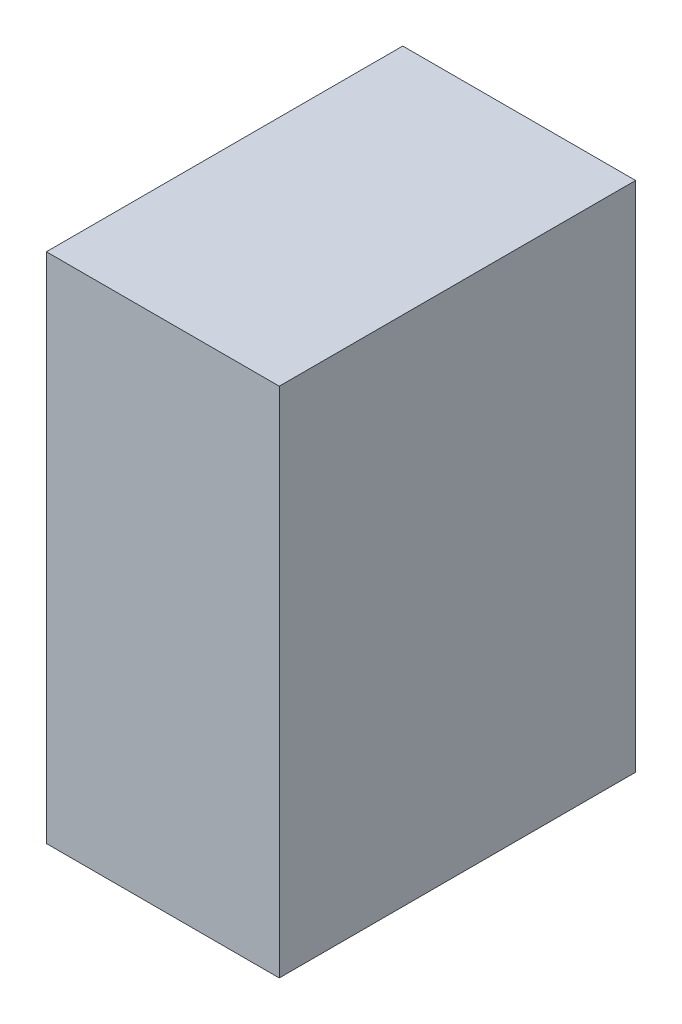
ISO-10303-21;
HEADER;
FILE_DESCRIPTION(('STEP AP214'),'2;1');
FILE_NAME('part.step','',(''),(''),'','','');
FILE_SCHEMA(('AUTOMOTIVE_DESIGN { 1 0 10303 214 1 1 1 1 }'));
ENDSEC;
DATA;
#1=APPLICATION_CONTEXT('core data for automotive mechanical design processes');
#2=APPLICATION_PROTOCOL_DEFINITION('international standard','automotive_design',2000,#1);
#3=PRODUCT_CONTEXT('',#1,'mechanical');
#4=PRODUCT('Part','Part','',(#3));
#5=PRODUCT_RELATED_PRODUCT_CATEGORY('part','',(#4));
#6=PRODUCT_DEFINITION_FORMATION('','',#4);
#7=PRODUCT_DEFINITION_CONTEXT('part definition',#1,'design');
#8=PRODUCT_DEFINITION('design','',#6,#7);
#9=PRODUCT_DEFINITION_SHAPE('','',#8);
#10=(LENGTH_UNIT() NAMED_UNIT(*) SI_UNIT(.MILLI.,.METRE.));
#11=(NAMED_UNIT(*) PLANE_ANGLE_UNIT() SI_UNIT($,.RADIAN.));
#12=(NAMED_UNIT(*) SI_UNIT($,.STERADIAN.) SOLID_ANGLE_UNIT());
#13=UNCERTAINTY_MEASURE_WITH_UNIT(LENGTH_MEASURE(1.E-05),#10,'distance_accuracy_value','');
#14=(GEOMETRIC_REPRESENTATION_CONTEXT(3) GLOBAL_UNCERTAINTY_ASSIGNED_CONTEXT((#13)) GLOBAL_UNIT_ASSIGNED_CONTEXT((#10,
#11,#12)) REPRESENTATION_CONTEXT('',''));
#15=CARTESIAN_POINT('',(0.,0.,0.));
#16=DIRECTION('',(0.,0.,1.));
#17=DIRECTION('',(1.,0.,0.));
#18=AXIS2_PLACEMENT_3D('',#15,#16,#17);
#19=CARTESIAN_POINT('',(3.64125341632052,-61.5,-36.98));
#20=DIRECTION('',(-1.,0.,0.));
#21=DIRECTION('',(0.,-1.,0.));
#22=AXIS2_PLACEMENT_3D('',#19,#20,#21);
#23=PLANE('',#22);
#24=DIRECTION('',(0.,-1.,0.));
#25=VECTOR('',#24,1.);
#26=CARTESIAN_POINT('',(3.64125341632052,-36.5,-36.99));
#27=LINE('',#26,#25);
#28=CARTESIAN_POINT('',(3.64125341632052,-36.5,-36.99));
#29=VERTEX_POINT('',#28);
#30=CARTESIAN_POINT('',(3.64125341632052,-61.5,-36.99));
#31=VERTEX_POINT('',#30);
#32=EDGE_CURVE('E37',#29,#31,#27,.T.);
#33=ORIENTED_EDGE('',*,*,#32,.F.);
#34=DIRECTION('',(0.,0.,1.));
#35=VECTOR('',#34,1.);
#36=CARTESIAN_POINT('',(3.64125341632052,-36.5,-36.99));
#37=LINE('',#36,#35);
#38=CARTESIAN_POINT('',(3.64125341632052,-36.5,-54.3725396741245));
#39=VERTEX_POINT('',#38);
#40=EDGE_CURVE('E89',#39,#29,#37,.T.);
#41=ORIENTED_EDGE('',*,*,#40,.F.);
#42=DIRECTION('',(0.,1.,0.));
#43=VECTOR('',#42,1.);
#44=CARTESIAN_POINT('',(3.64125341632052,-61.5,-54.3725396741245));
#45=LINE('',#44,#43);
#46=CARTESIAN_POINT('',(3.64125341632052,-61.5,-54.3725396741245));
#47=VERTEX_POINT('',#46);
#48=EDGE_CURVE('E78',#47,#39,#45,.T.);
#49=ORIENTED_EDGE('',*,*,#48,.F.);
#50=DIRECTION('',(0.,0.,-1.));
#51=VECTOR('',#50,1.);
#52=CARTESIAN_POINT('',(3.64125341632052,-61.5,-36.99));
#53=LINE('',#52,#51);
#54=EDGE_CURVE('E88',#31,#47,#53,.T.);
#55=ORIENTED_EDGE('',*,*,#54,.F.);
#56=EDGE_LOOP('',(#33,#41,#49,#55));
#57=FACE_BOUND('',#56,.T.);
#58=ADVANCED_FACE('F33',(#57),#23,.T.);
#59=CARTESIAN_POINT('',(-15.,-36.5,-36.99));
#60=DIRECTION('',(0.,1.,0.));
#61=DIRECTION('',(0.,0.,1.));
#62=AXIS2_PLACEMENT_3D('',#59,#60,#61);
#63=PLANE('',#62);
#64=DIRECTION('',(1.,0.,0.));
#65=VECTOR('',#64,1.);
#66=CARTESIAN_POINT('',(-15.,-36.5,-54.3725396741245));
#67=LINE('',#66,#65);
#68=CARTESIAN_POINT('',(15.,-36.5,-54.3725396741245));
#69=VERTEX_POINT('',#68);
#70=EDGE_CURVE('E83',#39,#69,#67,.T.);
#71=ORIENTED_EDGE('',*,*,#70,.F.);
#72=ORIENTED_EDGE('',*,*,#40,.T.);
#73=DIRECTION('',(1.,0.,0.));
#74=VECTOR('',#73,1.);
#75=CARTESIAN_POINT('',(-15.,-36.5,-36.99));
#76=LINE('',#75,#74);
#77=CARTESIAN_POINT('',(15.,-36.5,-36.99));
#78=VERTEX_POINT('',#77);
#79=EDGE_CURVE('E50',#29,#78,#76,.T.);
#80=ORIENTED_EDGE('',*,*,#79,.T.);
#81=DIRECTION('',(0.,0.,1.));
#82=VECTOR('',#81,1.);
#83=CARTESIAN_POINT('',(15.,-36.5,-36.99));
#84=LINE('',#83,#82);
#85=EDGE_CURVE('E11',#69,#78,#84,.T.);
#86=ORIENTED_EDGE('',*,*,#85,.F.);
#87=EDGE_LOOP('',(#71,#72,#80,#86));
#88=FACE_BOUND('',#87,.T.);
#89=ADVANCED_FACE('F92',(#88),#63,.T.);
#90=CARTESIAN_POINT('',(-15.,-61.5,-54.3725396741245));
#91=DIRECTION('',(0.,0.,-1.));
#92=DIRECTION('',(-1.,0.,0.));
#93=AXIS2_PLACEMENT_3D('',#90,#91,#92);
#94=PLANE('',#93);
#95=DIRECTION('',(1.,0.,0.));
#96=VECTOR('',#95,1.);
#97=CARTESIAN_POINT('',(-15.,-61.5,-54.3725396741245));
#98=LINE('',#97,#96);
#99=CARTESIAN_POINT('',(15.,-61.5,-54.3725396741245));
#100=VERTEX_POINT('',#99);
#101=EDGE_CURVE('E85',#47,#100,#98,.T.);
#102=ORIENTED_EDGE('',*,*,#101,.F.);
#103=ORIENTED_EDGE('',*,*,#48,.T.);
#104=ORIENTED_EDGE('',*,*,#70,.T.);
#105=DIRECTION('',(0.,1.,0.));
#106=VECTOR('',#105,1.);
#107=CARTESIAN_POINT('',(15.,-61.5,-54.3725396741245));
#108=LINE('',#107,#106);
#109=EDGE_CURVE('E101',#100,#69,#108,.T.);
#110=ORIENTED_EDGE('',*,*,#109,.F.);
#111=EDGE_LOOP('',(#102,#103,#104,#110));
#112=FACE_BOUND('',#111,.T.);
#113=ADVANCED_FACE('F80',(#112),#94,.T.);
#114=CARTESIAN_POINT('',(-15.,-61.5,-36.99));
#115=DIRECTION('',(0.,-1.,0.));
#116=DIRECTION('',(0.,0.,-1.));
#117=AXIS2_PLACEMENT_3D('',#114,#115,#116);
#118=PLANE('',#117);
#119=DIRECTION('',(1.,0.,0.));
#120=VECTOR('',#119,1.);
#121=CARTESIAN_POINT('',(-15.,-61.5,-36.99));
#122=LINE('',#121,#120);
#123=CARTESIAN_POINT('',(15.,-61.5,-36.99));
#124=VERTEX_POINT('',#123);
#125=EDGE_CURVE('E57',#31,#124,#122,.T.);
#126=ORIENTED_EDGE('',*,*,#125,.F.);
#127=ORIENTED_EDGE('',*,*,#54,.T.);
#128=ORIENTED_EDGE('',*,*,#101,.T.);
#129=DIRECTION('',(0.,0.,-1.));
#130=VECTOR('',#129,1.);
#131=CARTESIAN_POINT('',(15.,-61.5,-36.99));
#132=LINE('',#131,#130);
#133=EDGE_CURVE('E100',#124,#100,#132,.T.);
#134=ORIENTED_EDGE('',*,*,#133,.F.);
#135=EDGE_LOOP('',(#126,#127,#128,#134));
#136=FACE_BOUND('',#135,.T.);
#137=ADVANCED_FACE('F97',(#136),#118,.T.);
#138=CARTESIAN_POINT('',(-15.,-36.5,-36.99));
#139=DIRECTION('',(0.,0.,1.));
#140=DIRECTION('',(0.,-1.,0.));
#141=AXIS2_PLACEMENT_3D('',#138,#139,#140);
#142=PLANE('',#141);
#143=ORIENTED_EDGE('',*,*,#79,.F.);
#144=ORIENTED_EDGE('',*,*,#32,.T.);
#145=ORIENTED_EDGE('',*,*,#125,.T.);
#146=DIRECTION('',(0.,-1.,0.));
#147=VECTOR('',#146,1.);
#148=CARTESIAN_POINT('',(15.,-36.5,-36.99));
#149=LINE('',#148,#147);
#150=EDGE_CURVE('E42',#78,#124,#149,.T.);
#151=ORIENTED_EDGE('',*,*,#150,.F.);
#152=EDGE_LOOP('',(#143,#144,#145,#151));
#153=FACE_BOUND('',#152,.T.);
#154=ADVANCED_FACE('F35',(#153),#142,.T.);
#155=CARTESIAN_POINT('',(15.,0.,0.));
#156=DIRECTION('',(1.,0.,0.));
#157=DIRECTION('',(0.,0.,-1.));
#158=AXIS2_PLACEMENT_3D('',#155,#156,#157);
#159=PLANE('',#158);
#160=ORIENTED_EDGE('',*,*,#85,.T.);
#161=ORIENTED_EDGE('',*,*,#150,.T.);
#162=ORIENTED_EDGE('',*,*,#133,.T.);
#163=ORIENTED_EDGE('',*,*,#109,.T.);
#164=EDGE_LOOP('',(#160,#161,#162,#163));
#165=FACE_BOUND('',#164,.T.);
#166=ADVANCED_FACE('F107',(#165),#159,.T.);
#167=CLOSED_SHELL('',(#58,#89,#113,#137,#154,#166));
#168=MANIFOLD_SOLID_BREP('B2',#167);
#169=ADVANCED_BREP_SHAPE_REPRESENTATION('',(#18,#168),#14);
#170=SHAPE_DEFINITION_REPRESENTATION(#9,#169);
ENDSEC;
END-ISO-10303-21;
